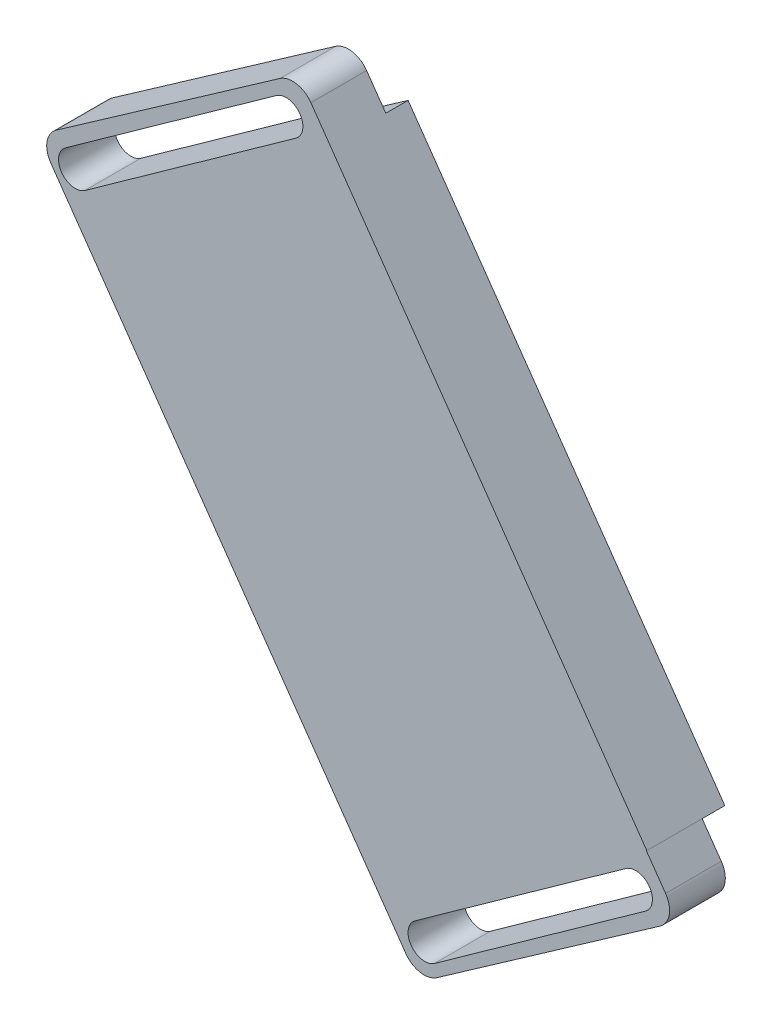
ISO-10303-21;
HEADER;
FILE_DESCRIPTION(('STEP AP214'),'2;1');
FILE_NAME('part.step','',(''),(''),'','','');
FILE_SCHEMA(('AUTOMOTIVE_DESIGN { 1 0 10303 214 1 1 1 1 }'));
ENDSEC;
DATA;
#1=APPLICATION_CONTEXT('core data for automotive mechanical design processes');
#2=APPLICATION_PROTOCOL_DEFINITION('international standard','automotive_design',2000,#1);
#3=PRODUCT_CONTEXT('',#1,'mechanical');
#4=PRODUCT('Part','Part','',(#3));
#5=PRODUCT_RELATED_PRODUCT_CATEGORY('part','',(#4));
#6=PRODUCT_DEFINITION_FORMATION('','',#4);
#7=PRODUCT_DEFINITION_CONTEXT('part definition',#1,'design');
#8=PRODUCT_DEFINITION('design','',#6,#7);
#9=PRODUCT_DEFINITION_SHAPE('','',#8);
#10=(LENGTH_UNIT() NAMED_UNIT(*) SI_UNIT(.MILLI.,.METRE.));
#11=(NAMED_UNIT(*) PLANE_ANGLE_UNIT() SI_UNIT($,.RADIAN.));
#12=(NAMED_UNIT(*) SI_UNIT($,.STERADIAN.) SOLID_ANGLE_UNIT());
#13=UNCERTAINTY_MEASURE_WITH_UNIT(LENGTH_MEASURE(1.E-05),#10,'distance_accuracy_value','');
#14=(GEOMETRIC_REPRESENTATION_CONTEXT(3) GLOBAL_UNCERTAINTY_ASSIGNED_CONTEXT((#13)) GLOBAL_UNIT_ASSIGNED_CONTEXT((#10,
#11,#12)) REPRESENTATION_CONTEXT('',''));
#15=CARTESIAN_POINT('',(0.,0.,0.));
#16=DIRECTION('',(0.,0.,1.));
#17=DIRECTION('',(1.,0.,0.));
#18=AXIS2_PLACEMENT_3D('',#15,#16,#17);
#19=CARTESIAN_POINT('',(-15.9091061048181,13.6425802063685,7.));
#20=DIRECTION('',(-0.573576436351048,0.81915204428899,0.));
#21=DIRECTION('',(-0.81915204428899,-0.573576436351048,0.));
#22=AXIS2_PLACEMENT_3D('',#19,#20,#21);
#23=PLANE('',#22);
#24=DIRECTION('',(0.,0.,-1.));
#25=VECTOR('',#24,1.);
#26=CARTESIAN_POINT('',(-15.9091061048181,13.6425802063685,7.));
#27=LINE('',#26,#25);
#28=CARTESIAN_POINT('',(-15.9091061048181,13.6425802063685,2.));
#29=VERTEX_POINT('',#28);
#30=CARTESIAN_POINT('',(-15.9091061048181,13.6425802063685,0.));
#31=VERTEX_POINT('',#30);
#32=EDGE_CURVE('E420',#29,#31,#27,.T.);
#33=ORIENTED_EDGE('',*,*,#32,.F.);
#34=DIRECTION('',(-0.81915204428899,-0.573576436351048,0.));
#35=VECTOR('',#34,1.);
#36=CARTESIAN_POINT('',(-15.9091061048181,13.6425802063685,2.));
#37=LINE('',#36,#35);
#38=CARTESIAN_POINT('',(7.43672715741817,29.9895086423735,2.));
#39=VERTEX_POINT('',#38);
#40=EDGE_CURVE('E285',#39,#29,#37,.T.);
#41=ORIENTED_EDGE('',*,*,#40,.F.);
#42=DIRECTION('',(0.,0.,1.));
#43=VECTOR('',#42,1.);
#44=CARTESIAN_POINT('',(7.4367271574182,29.9895086423734,7.));
#45=LINE('',#44,#43);
#46=CARTESIAN_POINT('',(7.4367271574182,29.9895086423734,0.));
#47=VERTEX_POINT('',#46);
#48=EDGE_CURVE('E339',#47,#39,#45,.T.);
#49=ORIENTED_EDGE('',*,*,#48,.F.);
#50=DIRECTION('',(0.81915204428899,0.573576436351048,0.));
#51=VECTOR('',#50,1.);
#52=CARTESIAN_POINT('',(-15.9091061048181,13.6425802063685,0.));
#53=LINE('',#52,#51);
#54=EDGE_CURVE('E417',#31,#47,#53,.T.);
#55=ORIENTED_EDGE('',*,*,#54,.F.);
#56=EDGE_LOOP('',(#33,#41,#49,#55));
#57=FACE_BOUND('',#56,.T.);
#58=ADVANCED_FACE('F58',(#57),#23,.T.);
#59=CARTESIAN_POINT('',(12.5116063163763,-26.9464035881509,7.));
#60=DIRECTION('',(-0.573576436351045,0.819152044288992,0.));
#61=DIRECTION('',(-0.819152044288992,-0.573576436351045,0.));
#62=AXIS2_PLACEMENT_3D('',#59,#60,#61);
#63=PLANE('',#62);
#64=DIRECTION('',(0.819152044288992,0.573576436351045,0.));
#65=VECTOR('',#64,1.);
#66=CARTESIAN_POINT('',(12.5116063163763,-26.9464035881509,2.));
#67=LINE('',#66,#65);
#68=CARTESIAN_POINT('',(12.5116063163763,-26.9464035881509,2.));
#69=VERTEX_POINT('',#68);
#70=CARTESIAN_POINT('',(35.8186756591524,-10.6266179407626,2.));
#71=VERTEX_POINT('',#70);
#72=EDGE_CURVE('E321',#69,#71,#67,.T.);
#73=ORIENTED_EDGE('',*,*,#72,.F.);
#74=DIRECTION('',(0.,0.,-1.));
#75=VECTOR('',#74,1.);
#76=CARTESIAN_POINT('',(12.5116063163763,-26.9464035881509,7.));
#77=LINE('',#76,#75);
#78=CARTESIAN_POINT('',(12.5116063163763,-26.9464035881509,0.));
#79=VERTEX_POINT('',#78);
#80=EDGE_CURVE('E427',#69,#79,#77,.T.);
#81=ORIENTED_EDGE('',*,*,#80,.T.);
#82=DIRECTION('',(0.819152044288992,0.573576436351045,0.));
#83=VECTOR('',#82,1.);
#84=CARTESIAN_POINT('',(12.5116063163763,-26.9464035881509,0.));
#85=LINE('',#84,#83);
#86=CARTESIAN_POINT('',(35.8574395786125,-10.5994751521461,0.));
#87=VERTEX_POINT('',#86);
#88=EDGE_CURVE('E423',#79,#87,#85,.T.);
#89=ORIENTED_EDGE('',*,*,#88,.T.);
#90=DIRECTION('',(0.,0.,1.));
#91=VECTOR('',#90,1.);
#92=CARTESIAN_POINT('',(35.8574395786125,-10.5994751521461,7.));
#93=LINE('',#92,#91);
#94=CARTESIAN_POINT('',(35.8574395786125,-10.5994751521461,7.));
#95=VERTEX_POINT('',#94);
#96=EDGE_CURVE('E338',#87,#95,#93,.T.);
#97=ORIENTED_EDGE('',*,*,#96,.T.);
#98=DIRECTION('',(0.819152044288992,0.573576436351045,0.));
#99=VECTOR('',#98,1.);
#100=CARTESIAN_POINT('',(12.5116063163763,-26.9464035881509,7.));
#101=LINE('',#100,#99);
#102=CARTESIAN_POINT('',(35.8186756591524,-10.6266179407626,7.));
#103=VERTEX_POINT('',#102);
#104=EDGE_CURVE('E416',#103,#95,#101,.T.);
#105=ORIENTED_EDGE('',*,*,#104,.F.);
#106=DIRECTION('',(0.,0.,1.));
#107=VECTOR('',#106,1.);
#108=CARTESIAN_POINT('',(35.8186756591524,-10.6266179407626,2.));
#109=LINE('',#108,#107);
#110=EDGE_CURVE('E325',#71,#103,#109,.T.);
#111=ORIENTED_EDGE('',*,*,#110,.F.);
#112=EDGE_LOOP('',(#73,#81,#89,#97,#105,#111));
#113=FACE_BOUND('',#112,.T.);
#114=ADVANCED_FACE('F503',(#113),#63,.F.);
#115=CARTESIAN_POINT('',(0.,0.,0.));
#116=DIRECTION('',(0.,0.,1.));
#117=DIRECTION('',(1.,0.,0.));
#118=AXIS2_PLACEMENT_3D('',#115,#116,#117);
#119=PLANE('',#118);
#120=DIRECTION('',(0.573576436351048,-0.819152044288991,0.));
#121=VECTOR('',#120,1.);
#122=CARTESIAN_POINT('',(-15.9091061048181,13.6425802063685,0.));
#123=LINE('',#122,#121);
#124=EDGE_CURVE('E412',#31,#79,#123,.T.);
#125=ORIENTED_EDGE('',*,*,#124,.F.);
#126=ORIENTED_EDGE('',*,*,#54,.T.);
#127=DIRECTION('',(0.573576436351045,-0.819152044288992,0.));
#128=VECTOR('',#127,1.);
#129=CARTESIAN_POINT('',(7.4367271574182,29.9895086423734,0.));
#130=LINE('',#129,#128);
#131=EDGE_CURVE('E342',#47,#87,#130,.T.);
#132=ORIENTED_EDGE('',*,*,#131,.T.);
#133=ORIENTED_EDGE('',*,*,#88,.F.);
#134=EDGE_LOOP('',(#125,#126,#132,#133));
#135=FACE_BOUND('',#134,.T.);
#136=DIRECTION('',(0.819152044289,0.573576436351034,0.));
#137=VECTOR('',#136,1.);
#138=CARTESIAN_POINT('',(16.6392073779755,-23.7632508506252,0.));
#139=LINE('',#138,#137);
#140=CARTESIAN_POINT('',(13.2041115311021,-26.1685308570787,0.));
#141=VERTEX_POINT('',#140);
#142=CARTESIAN_POINT('',(13.6956027576755,-25.8243849952681,0.));
#143=VERTEX_POINT('',#142);
#144=EDGE_CURVE('E387',#141,#143,#139,.T.);
#145=ORIENTED_EDGE('',*,*,#144,.T.);
#146=DIRECTION('',(0.573576436351045,-0.819152044288992,0.));
#147=VECTOR('',#146,1.);
#148=CARTESIAN_POINT('',(-2.94360462030027,-2.06113414464318,0.));
#149=LINE('',#148,#147);
#150=CARTESIAN_POINT('',(-14.5004018426838,14.4436827728267,0.));
#151=VERTEX_POINT('',#150);
#152=EDGE_CURVE('E382',#151,#143,#149,.T.);
#153=ORIENTED_EDGE('',*,*,#152,.F.);
#154=DIRECTION('',(0.819152044288993,0.573576436351045,0.));
#155=VECTOR('',#154,1.);
#156=CARTESIAN_POINT('',(-11.5567972223835,16.5048169174699,0.));
#157=LINE('',#156,#155);
#158=CARTESIAN_POINT('',(-14.9918930692572,14.0995369110161,0.));
#159=VERTEX_POINT('',#158);
#160=EDGE_CURVE('E396',#159,#151,#157,.T.);
#161=ORIENTED_EDGE('',*,*,#160,.F.);
#162=DIRECTION('',(0.573576436351045,-0.819152044288992,0.));
#163=VECTOR('',#162,1.);
#164=CARTESIAN_POINT('',(-3.43509584687367,-2.4052800064538,0.));
#165=LINE('',#164,#163);
#166=EDGE_CURVE('E399',#159,#141,#165,.T.);
#167=ORIENTED_EDGE('',*,*,#166,.T.);
#168=EDGE_LOOP('',(#145,#153,#161,#167));
#169=FACE_BOUND('',#168,.T.);
#170=DIRECTION('',(-0.819152044288987,-0.573576436351053,0.));
#171=VECTOR('',#170,1.);
#172=CARTESIAN_POINT('',(-11.5326628883823,16.4703495164716,0.));
#173=LINE('',#172,#171);
#174=CARTESIAN_POINT('',(-6.36666227022138,20.087622091704,0.));
#175=VERTEX_POINT('',#174);
#176=CARTESIAN_POINT('',(-6.85815349679478,19.7434762298934,0.));
#177=VERTEX_POINT('',#176);
#178=EDGE_CURVE('E347',#175,#177,#173,.T.);
#179=ORIENTED_EDGE('',*,*,#178,.T.);
#180=DIRECTION('',(0.573576436351053,-0.819152044288987,0.));
#181=VECTOR('',#180,1.);
#182=CARTESIAN_POINT('',(4.67450939158751,3.27312671342172,0.));
#183=LINE('',#182,#181);
#184=CARTESIAN_POINT('',(21.3049039693914,-20.4775381542033,0.));
#185=VERTEX_POINT('',#184);
#186=EDGE_CURVE('E365',#177,#185,#183,.T.);
#187=ORIENTED_EDGE('',*,*,#186,.T.);
#188=DIRECTION('',(-0.819152044288988,-0.573576436351051,0.));
#189=VECTOR('',#188,1.);
#190=CARTESIAN_POINT('',(16.6303945778038,-23.7506648676251,0.));
#191=LINE('',#190,#189);
#192=CARTESIAN_POINT('',(21.7963951959648,-20.1333922923927,0.));
#193=VERTEX_POINT('',#192);
#194=EDGE_CURVE('E368',#193,#185,#191,.T.);
#195=ORIENTED_EDGE('',*,*,#194,.F.);
#196=DIRECTION('',(0.573576436351053,-0.819152044288987,0.));
#197=VECTOR('',#196,1.);
#198=CARTESIAN_POINT('',(5.16600061816091,3.61727257523235,0.));
#199=LINE('',#198,#197);
#200=EDGE_CURVE('E354',#175,#193,#199,.T.);
#201=ORIENTED_EDGE('',*,*,#200,.F.);
#202=EDGE_LOOP('',(#179,#187,#195,#201));
#203=FACE_BOUND('',#202,.T.);
#204=ADVANCED_FACE('F532',(#135,#169,#203),#119,.F.);
#205=CARTESIAN_POINT('',(-15.9091061048181,13.6425802063685,7.));
#206=DIRECTION('',(0.819152044288991,0.573576436351048,0.));
#207=DIRECTION('',(-0.573576436351048,0.819152044288991,0.));
#208=AXIS2_PLACEMENT_3D('',#205,#206,#207);
#209=PLANE('',#208);
#210=DIRECTION('',(0.573576436351048,-0.819152044288991,0.));
#211=VECTOR('',#210,1.);
#212=CARTESIAN_POINT('',(-15.9091061048181,13.6425802063685,7.));
#213=LINE('',#212,#211);
#214=CARTESIAN_POINT('',(-17.6298354138713,16.1000363392355,7.));
#215=VERTEX_POINT('',#214);
#216=CARTESIAN_POINT('',(14.2323356254294,-29.4038597210179,7.));
#217=VERTEX_POINT('',#216);
#218=EDGE_CURVE('E413',#215,#217,#213,.T.);
#219=ORIENTED_EDGE('',*,*,#218,.F.);
#220=DIRECTION('',(0.,0.,1.));
#221=VECTOR('',#220,1.);
#222=CARTESIAN_POINT('',(-17.6298354138713,16.1000363392355,7.));
#223=LINE('',#222,#221);
#224=CARTESIAN_POINT('',(-17.6298354138713,16.1000363392355,2.));
#225=VERTEX_POINT('',#224);
#226=EDGE_CURVE('E466',#215,#225,#223,.F.);
#227=ORIENTED_EDGE('',*,*,#226,.T.);
#228=DIRECTION('',(0.573576436351048,-0.81915204428899,0.));
#229=VECTOR('',#228,1.);
#230=CARTESIAN_POINT('',(-18.7769882865734,17.7383404278135,2.));
#231=LINE('',#230,#229);
#232=EDGE_CURVE('E315',#225,#29,#231,.T.);
#233=ORIENTED_EDGE('',*,*,#232,.T.);
#234=ORIENTED_EDGE('',*,*,#32,.T.);
#235=ORIENTED_EDGE('',*,*,#124,.T.);
#236=ORIENTED_EDGE('',*,*,#80,.F.);
#237=DIRECTION('',(-0.573576436351045,0.819152044288992,0.));
#238=VECTOR('',#237,1.);
#239=CARTESIAN_POINT('',(15.3794884981315,-31.0421638095959,2.));
#240=LINE('',#239,#238);
#241=CARTESIAN_POINT('',(14.2323356254294,-29.4038597210179,2.));
#242=VERTEX_POINT('',#241);
#243=EDGE_CURVE('E336',#242,#69,#240,.T.);
#244=ORIENTED_EDGE('',*,*,#243,.F.);
#245=DIRECTION('',(0.,0.,-1.));
#246=VECTOR('',#245,1.);
#247=CARTESIAN_POINT('',(14.2323356254294,-29.4038597210179,7.));
#248=LINE('',#247,#246);
#249=EDGE_CURVE('E464',#242,#217,#248,.F.);
#250=ORIENTED_EDGE('',*,*,#249,.T.);
#251=EDGE_LOOP('',(#219,#227,#233,#234,#235,#236,#244,#250));
#252=FACE_BOUND('',#251,.T.);
#253=ADVANCED_FACE('F489',(#252),#209,.F.);
#254=CARTESIAN_POINT('',(0.,0.,7.));
#255=DIRECTION('',(0.,0.,1.));
#256=DIRECTION('',(1.,0.,0.));
#257=AXIS2_PLACEMENT_3D('',#254,#255,#256);
#258=PLANE('',#257);
#259=CARTESIAN_POINT('',(34.8610503496757,-14.1440881042099,7.00000000000001));
#260=DIRECTION('',(0.,0.,-1.));
#261=DIRECTION('',(-1.,0.,0.));
#262=AXIS2_PLACEMENT_3D('',#259,#260,#261);
#263=CIRCLE('',#262,1.5);
#264=CARTESIAN_POINT('',(33.9887755083496,-12.9237862558177,7.00000000000001));
#265=VERTEX_POINT('',#264);
#266=CARTESIAN_POINT('',(35.7333251910018,-15.3643899526022,7.00000000000001));
#267=VERTEX_POINT('',#266);
#268=EDGE_CURVE('E254',#265,#267,#263,.T.);
#269=ORIENTED_EDGE('',*,*,#268,.T.);
#270=DIRECTION('',(-0.813534565594845,-0.581516560884044,0.));
#271=VECTOR('',#270,1.);
#272=CARTESIAN_POINT('',(35.7333251910018,-15.3643899526022,7.00000000000001));
#273=LINE('',#272,#271);
#274=CARTESIAN_POINT('',(16.8071757288284,-28.8928493585933,7.));
#275=VERTEX_POINT('',#274);
#276=EDGE_CURVE('E265',#267,#275,#273,.T.);
#277=ORIENTED_EDGE('',*,*,#276,.T.);
#278=CARTESIAN_POINT('',(15.9349008875023,-27.6725475102011,7.00000000000001));
#279=DIRECTION('',(0.,0.,-1.));
#280=DIRECTION('',(-1.,0.,0.));
#281=AXIS2_PLACEMENT_3D('',#278,#279,#280);
#282=CIRCLE('',#281,1.5);
#283=CARTESIAN_POINT('',(15.0626260461762,-26.4522456618088,7.00000000000001));
#284=VERTEX_POINT('',#283);
#285=EDGE_CURVE('E270',#275,#284,#282,.T.);
#286=ORIENTED_EDGE('',*,*,#285,.T.);
#287=DIRECTION('',(0.813534565594845,0.581516560884044,0.));
#288=VECTOR('',#287,1.);
#289=CARTESIAN_POINT('',(33.9887755083496,-12.9237862558177,7.00000000000001));
#290=LINE('',#289,#288);
#291=EDGE_CURVE('E261',#284,#265,#290,.T.);
#292=ORIENTED_EDGE('',*,*,#291,.T.);
#293=EDGE_LOOP('',(#269,#277,#286,#292));
#294=FACE_BOUND('',#293,.T.);
#295=CARTESIAN_POINT('',(3.4964367911128,30.2392771419821,7.00000000000001));
#296=DIRECTION('',(0.,0.,-1.));
#297=DIRECTION('',(-1.,0.,0.));
#298=AXIS2_PLACEMENT_3D('',#295,#296,#297);
#299=CIRCLE('',#298,1.50000000000001);
#300=CARTESIAN_POINT('',(2.62416194978673,31.4595789903744,7.00000000000001));
#301=VERTEX_POINT('',#300);
#302=CARTESIAN_POINT('',(4.36871163243887,29.0189752935899,7.00000000000001));
#303=VERTEX_POINT('',#302);
#304=EDGE_CURVE('E290',#301,#303,#299,.T.);
#305=ORIENTED_EDGE('',*,*,#304,.T.);
#306=DIRECTION('',(-0.813534565594845,-0.581516560884044,0.));
#307=VECTOR('',#306,1.);
#308=CARTESIAN_POINT('',(4.36871163243887,29.0189752935899,7.00000000000001));
#309=LINE('',#308,#307);
#310=CARTESIAN_POINT('',(-14.5574378297346,15.4905158875988,7.));
#311=VERTEX_POINT('',#310);
#312=EDGE_CURVE('E293',#303,#311,#309,.T.);
#313=ORIENTED_EDGE('',*,*,#312,.T.);
#314=CARTESIAN_POINT('',(-15.4297126710606,16.710817735991,7.00000000000001));
#315=DIRECTION('',(0.,0.,-1.));
#316=DIRECTION('',(-1.,0.,0.));
#317=AXIS2_PLACEMENT_3D('',#314,#315,#316);
#318=CIRCLE('',#317,1.5);
#319=CARTESIAN_POINT('',(-16.3019875123867,17.9311195843833,7.00000000000001));
#320=VERTEX_POINT('',#319);
#321=EDGE_CURVE('E296',#311,#320,#318,.T.);
#322=ORIENTED_EDGE('',*,*,#321,.T.);
#323=DIRECTION('',(0.813534565594845,0.581516560884044,0.));
#324=VECTOR('',#323,1.);
#325=CARTESIAN_POINT('',(2.62416194978673,31.4595789903744,7.00000000000001));
#326=LINE('',#325,#324);
#327=EDGE_CURVE('E299',#320,#301,#326,.T.);
#328=ORIENTED_EDGE('',*,*,#327,.T.);
#329=EDGE_LOOP('',(#305,#313,#322,#328));
#330=FACE_BOUND('',#329,.T.);
#331=DIRECTION('',(0.81915204428899,0.573576436351048,0.));
#332=VECTOR('',#331,1.);
#333=CARTESIAN_POINT('',(-18.7769882865734,17.7383404278135,7.));
#334=LINE('',#333,#332);
#335=CARTESIAN_POINT('',(-17.1386841979954,18.8854933005156,7.));
#336=VERTEX_POINT('',#335);
#337=CARTESIAN_POINT('',(2.93054088708496,32.9381159911164,7.));
#338=VERTEX_POINT('',#337);
#339=EDGE_CURVE('E309',#336,#338,#334,.T.);
#340=ORIENTED_EDGE('',*,*,#339,.F.);
#341=CARTESIAN_POINT('',(-15.9915313252933,17.2471892119376,7.));
#342=DIRECTION('',(0.,0.,1.));
#343=DIRECTION('',(1.,0.,0.));
#344=AXIS2_PLACEMENT_3D('',#341,#342,#343);
#345=CIRCLE('',#344,2.);
#346=EDGE_CURVE('E462',#336,#215,#345,.T.);
#347=ORIENTED_EDGE('',*,*,#346,.T.);
#348=ORIENTED_EDGE('',*,*,#218,.T.);
#349=CARTESIAN_POINT('',(15.8706397140074,-28.2567068483158,7.));
#350=DIRECTION('',(0.,0.,1.));
#351=DIRECTION('',(1.,0.,0.));
#352=AXIS2_PLACEMENT_3D('',#349,#350,#351);
#353=CIRCLE('',#352,2.);
#354=CARTESIAN_POINT('',(17.0177925867095,-29.8950109368938,7.));
#355=VERTEX_POINT('',#354);
#356=EDGE_CURVE('E458',#217,#355,#353,.T.);
#357=ORIENTED_EDGE('',*,*,#356,.T.);
#358=DIRECTION('',(-0.819152044288992,-0.573576436351045,0.));
#359=VECTOR('',#358,1.);
#360=CARTESIAN_POINT('',(15.3794884981315,-31.0421638095959,7.));
#361=LINE('',#360,#359);
#362=CARTESIAN_POINT('',(37.0482537523297,-15.8695310349097,7.));
#363=VERTEX_POINT('',#362);
#364=EDGE_CURVE('E324',#363,#355,#361,.T.);
#365=ORIENTED_EDGE('',*,*,#364,.F.);
#366=CARTESIAN_POINT('',(35.9011008796276,-14.2312269463317,7.));
#367=DIRECTION('',(0.,0.,1.));
#368=DIRECTION('',(1.,0.,0.));
#369=AXIS2_PLACEMENT_3D('',#366,#367,#368);
#370=CIRCLE('',#369,2.);
#371=CARTESIAN_POINT('',(37.5394049682056,-13.0840740736296,7.));
#372=VERTEX_POINT('',#371);
#373=EDGE_CURVE('E456',#363,#372,#370,.T.);
#374=ORIENTED_EDGE('',*,*,#373,.T.);
#375=DIRECTION('',(-0.573576436351045,0.819152044288992,0.));
#376=VECTOR('',#375,1.);
#377=CARTESIAN_POINT('',(38.6865578409077,-14.7223781622076,7.));
#378=LINE('',#377,#376);
#379=EDGE_CURVE('E328',#372,#103,#378,.T.);
#380=ORIENTED_EDGE('',*,*,#379,.T.);
#381=ORIENTED_EDGE('',*,*,#104,.T.);
#382=DIRECTION('',(0.573576436351045,-0.819152044288992,0.));
#383=VECTOR('',#382,1.);
#384=CARTESIAN_POINT('',(7.4367271574182,29.9895086423734,7.));
#385=LINE('',#384,#383);
#386=CARTESIAN_POINT('',(5.71599784836502,32.4469647752405,7.));
#387=VERTEX_POINT('',#386);
#388=EDGE_CURVE('E345',#387,#95,#385,.T.);
#389=ORIENTED_EDGE('',*,*,#388,.F.);
#390=CARTESIAN_POINT('',(4.07769375978704,31.2998119025384,7.));
#391=DIRECTION('',(0.,0.,1.));
#392=DIRECTION('',(1.,0.,0.));
#393=AXIS2_PLACEMENT_3D('',#390,#391,#392);
#394=CIRCLE('',#393,2.);
#395=EDGE_CURVE('E460',#387,#338,#394,.T.);
#396=ORIENTED_EDGE('',*,*,#395,.T.);
#397=EDGE_LOOP('',(#340,#347,#348,#357,#365,#374,#380,#381,#389,#396));
#398=FACE_BOUND('',#397,.T.);
#399=ADVANCED_FACE('F272',(#294,#330,#398),#258,.T.);
#400=CARTESIAN_POINT('',(-2.94360462030027,-2.06113414464318,6.));
#401=DIRECTION('',(0.819152044288992,0.573576436351045,0.));
#402=DIRECTION('',(-0.573576436351045,0.819152044288992,0.));
#403=AXIS2_PLACEMENT_3D('',#400,#401,#402);
#404=PLANE('',#403);
#405=ORIENTED_EDGE('',*,*,#152,.T.);
#406=DIRECTION('',(0.,0.,-1.));
#407=VECTOR('',#406,1.);
#408=CARTESIAN_POINT('',(13.6956027576755,-25.8243849952681,6.));
#409=LINE('',#408,#407);
#410=CARTESIAN_POINT('',(13.6956027576755,-25.8243849952681,6.));
#411=VERTEX_POINT('',#410);
#412=EDGE_CURVE('E394',#411,#143,#409,.T.);
#413=ORIENTED_EDGE('',*,*,#412,.F.);
#414=DIRECTION('',(0.573576436351045,-0.819152044288992,0.));
#415=VECTOR('',#414,1.);
#416=CARTESIAN_POINT('',(-2.94360462030027,-2.06113414464318,6.));
#417=LINE('',#416,#415);
#418=CARTESIAN_POINT('',(-14.5004018426838,14.4436827728267,6.));
#419=VERTEX_POINT('',#418);
#420=EDGE_CURVE('E383',#419,#411,#417,.T.);
#421=ORIENTED_EDGE('',*,*,#420,.F.);
#422=DIRECTION('',(0.,0.,-1.));
#423=VECTOR('',#422,1.);
#424=CARTESIAN_POINT('',(-14.5004018426838,14.4436827728267,6.));
#425=LINE('',#424,#423);
#426=EDGE_CURVE('E410',#419,#151,#425,.T.);
#427=ORIENTED_EDGE('',*,*,#426,.T.);
#428=EDGE_LOOP('',(#405,#413,#421,#427));
#429=FACE_BOUND('',#428,.T.);
#430=ADVANCED_FACE('F644',(#429),#404,.F.);
#431=CARTESIAN_POINT('',(-11.5567972223835,16.5048169174699,6.));
#432=DIRECTION('',(-0.573576436351045,0.819152044288993,0.));
#433=DIRECTION('',(-0.819152044288993,-0.573576436351045,0.));
#434=AXIS2_PLACEMENT_3D('',#431,#432,#433);
#435=PLANE('',#434);
#436=ORIENTED_EDGE('',*,*,#160,.T.);
#437=ORIENTED_EDGE('',*,*,#426,.F.);
#438=DIRECTION('',(0.819152044288993,0.573576436351045,0.));
#439=VECTOR('',#438,1.);
#440=CARTESIAN_POINT('',(-11.5567972223835,16.5048169174699,6.));
#441=LINE('',#440,#439);
#442=CARTESIAN_POINT('',(-14.9918930692572,14.0995369110161,6.));
#443=VERTEX_POINT('',#442);
#444=EDGE_CURVE('E386',#443,#419,#441,.T.);
#445=ORIENTED_EDGE('',*,*,#444,.F.);
#446=DIRECTION('',(0.,0.,-1.));
#447=VECTOR('',#446,1.);
#448=CARTESIAN_POINT('',(-14.9918930692572,14.0995369110161,6.));
#449=LINE('',#448,#447);
#450=EDGE_CURVE('E408',#443,#159,#449,.T.);
#451=ORIENTED_EDGE('',*,*,#450,.T.);
#452=EDGE_LOOP('',(#436,#437,#445,#451));
#453=FACE_BOUND('',#452,.T.);
#454=ADVANCED_FACE('F817',(#453),#435,.F.);
#455=CARTESIAN_POINT('',(-3.43509584687367,-2.4052800064538,6.));
#456=DIRECTION('',(0.819152044288992,0.573576436351045,0.));
#457=DIRECTION('',(-0.573576436351045,0.819152044288992,0.));
#458=AXIS2_PLACEMENT_3D('',#455,#456,#457);
#459=PLANE('',#458);
#460=ORIENTED_EDGE('',*,*,#166,.F.);
#461=ORIENTED_EDGE('',*,*,#450,.F.);
#462=DIRECTION('',(0.573576436351045,-0.819152044288992,0.));
#463=VECTOR('',#462,1.);
#464=CARTESIAN_POINT('',(-3.43509584687367,-2.4052800064538,6.));
#465=LINE('',#464,#463);
#466=CARTESIAN_POINT('',(13.2041115311021,-26.1685308570787,6.));
#467=VERTEX_POINT('',#466);
#468=EDGE_CURVE('E390',#443,#467,#465,.T.);
#469=ORIENTED_EDGE('',*,*,#468,.T.);
#470=DIRECTION('',(0.,0.,-1.));
#471=VECTOR('',#470,1.);
#472=CARTESIAN_POINT('',(13.2041115311021,-26.1685308570787,6.));
#473=LINE('',#472,#471);
#474=EDGE_CURVE('E406',#467,#141,#473,.T.);
#475=ORIENTED_EDGE('',*,*,#474,.T.);
#476=EDGE_LOOP('',(#460,#461,#469,#475));
#477=FACE_BOUND('',#476,.T.);
#478=ADVANCED_FACE('F807',(#477),#459,.T.);
#479=CARTESIAN_POINT('',(16.6392073779755,-23.7632508506252,6.));
#480=DIRECTION('',(-0.573576436351034,0.819152044289,0.));
#481=DIRECTION('',(-0.819152044289,-0.573576436351034,0.));
#482=AXIS2_PLACEMENT_3D('',#479,#480,#481);
#483=PLANE('',#482);
#484=ORIENTED_EDGE('',*,*,#144,.F.);
#485=ORIENTED_EDGE('',*,*,#474,.F.);
#486=DIRECTION('',(0.819152044289,0.573576436351034,0.));
#487=VECTOR('',#486,1.);
#488=CARTESIAN_POINT('',(16.6392073779755,-23.7632508506252,6.));
#489=LINE('',#488,#487);
#490=EDGE_CURVE('E392',#467,#411,#489,.T.);
#491=ORIENTED_EDGE('',*,*,#490,.T.);
#492=ORIENTED_EDGE('',*,*,#412,.T.);
#493=EDGE_LOOP('',(#484,#485,#491,#492));
#494=FACE_BOUND('',#493,.T.);
#495=ADVANCED_FACE('F797',(#494),#483,.T.);
#496=CARTESIAN_POINT('',(0.,0.,6.));
#497=DIRECTION('',(0.,0.,1.));
#498=DIRECTION('',(1.,0.,0.));
#499=AXIS2_PLACEMENT_3D('',#496,#497,#498);
#500=PLANE('',#499);
#501=ORIENTED_EDGE('',*,*,#420,.T.);
#502=ORIENTED_EDGE('',*,*,#490,.F.);
#503=ORIENTED_EDGE('',*,*,#468,.F.);
#504=ORIENTED_EDGE('',*,*,#444,.T.);
#505=EDGE_LOOP('',(#501,#502,#503,#504));
#506=FACE_BOUND('',#505,.T.);
#507=ADVANCED_FACE('F787',(#506),#500,.F.);
#508=CARTESIAN_POINT('',(-11.5326628883823,16.4703495164716,6.));
#509=DIRECTION('',(0.573576436351053,-0.819152044288987,0.));
#510=DIRECTION('',(0.819152044288987,0.573576436351053,0.));
#511=AXIS2_PLACEMENT_3D('',#508,#509,#510);
#512=PLANE('',#511);
#513=ORIENTED_EDGE('',*,*,#178,.F.);
#514=DIRECTION('',(0.,0.,-1.));
#515=VECTOR('',#514,1.);
#516=CARTESIAN_POINT('',(-6.36666227022138,20.087622091704,6.));
#517=LINE('',#516,#515);
#518=CARTESIAN_POINT('',(-6.36666227022138,20.087622091704,6.));
#519=VERTEX_POINT('',#518);
#520=EDGE_CURVE('E362',#519,#175,#517,.T.);
#521=ORIENTED_EDGE('',*,*,#520,.F.);
#522=DIRECTION('',(-0.819152044288987,-0.573576436351053,0.));
#523=VECTOR('',#522,1.);
#524=CARTESIAN_POINT('',(-11.5326628883823,16.4703495164716,6.));
#525=LINE('',#524,#523);
#526=CARTESIAN_POINT('',(-6.85815349679478,19.7434762298934,6.));
#527=VERTEX_POINT('',#526);
#528=EDGE_CURVE('E350',#519,#527,#525,.T.);
#529=ORIENTED_EDGE('',*,*,#528,.T.);
#530=DIRECTION('',(0.,0.,-1.));
#531=VECTOR('',#530,1.);
#532=CARTESIAN_POINT('',(-6.85815349679478,19.7434762298934,6.));
#533=LINE('',#532,#531);
#534=EDGE_CURVE('E379',#527,#177,#533,.T.);
#535=ORIENTED_EDGE('',*,*,#534,.T.);
#536=EDGE_LOOP('',(#513,#521,#529,#535));
#537=FACE_BOUND('',#536,.T.);
#538=ADVANCED_FACE('F777',(#537),#512,.T.);
#539=CARTESIAN_POINT('',(4.67450939158751,3.27312671342172,6.));
#540=DIRECTION('',(0.819152044288987,0.573576436351053,0.));
#541=DIRECTION('',(-0.573576436351053,0.819152044288987,0.));
#542=AXIS2_PLACEMENT_3D('',#539,#540,#541);
#543=PLANE('',#542);
#544=ORIENTED_EDGE('',*,*,#186,.F.);
#545=ORIENTED_EDGE('',*,*,#534,.F.);
#546=DIRECTION('',(0.573576436351053,-0.819152044288987,0.));
#547=VECTOR('',#546,1.);
#548=CARTESIAN_POINT('',(4.67450939158751,3.27312671342172,6.));
#549=LINE('',#548,#547);
#550=CARTESIAN_POINT('',(21.3049039693914,-20.4775381542033,6.));
#551=VERTEX_POINT('',#550);
#552=EDGE_CURVE('E353',#527,#551,#549,.T.);
#553=ORIENTED_EDGE('',*,*,#552,.T.);
#554=DIRECTION('',(0.,0.,-1.));
#555=VECTOR('',#554,1.);
#556=CARTESIAN_POINT('',(21.3049039693914,-20.4775381542033,6.));
#557=LINE('',#556,#555);
#558=EDGE_CURVE('E377',#551,#185,#557,.T.);
#559=ORIENTED_EDGE('',*,*,#558,.T.);
#560=EDGE_LOOP('',(#544,#545,#553,#559));
#561=FACE_BOUND('',#560,.T.);
#562=ADVANCED_FACE('F767',(#561),#543,.T.);
#563=CARTESIAN_POINT('',(16.6303945778038,-23.7506648676251,6.));
#564=DIRECTION('',(0.573576436351051,-0.819152044288988,0.));
#565=DIRECTION('',(0.819152044288988,0.573576436351051,0.));
#566=AXIS2_PLACEMENT_3D('',#563,#564,#565);
#567=PLANE('',#566);
#568=ORIENTED_EDGE('',*,*,#194,.T.);
#569=ORIENTED_EDGE('',*,*,#558,.F.);
#570=DIRECTION('',(-0.819152044288988,-0.573576436351051,0.));
#571=VECTOR('',#570,1.);
#572=CARTESIAN_POINT('',(16.6303945778038,-23.7506648676251,6.));
#573=LINE('',#572,#571);
#574=CARTESIAN_POINT('',(21.7963951959648,-20.1333922923927,6.));
#575=VERTEX_POINT('',#574);
#576=EDGE_CURVE('E356',#575,#551,#573,.T.);
#577=ORIENTED_EDGE('',*,*,#576,.F.);
#578=DIRECTION('',(0.,0.,-1.));
#579=VECTOR('',#578,1.);
#580=CARTESIAN_POINT('',(21.7963951959648,-20.1333922923927,6.));
#581=LINE('',#580,#579);
#582=EDGE_CURVE('E375',#575,#193,#581,.T.);
#583=ORIENTED_EDGE('',*,*,#582,.T.);
#584=EDGE_LOOP('',(#568,#569,#577,#583));
#585=FACE_BOUND('',#584,.T.);
#586=ADVANCED_FACE('F757',(#585),#567,.F.);
#587=CARTESIAN_POINT('',(5.16600061816091,3.61727257523235,6.));
#588=DIRECTION('',(0.819152044288987,0.573576436351053,0.));
#589=DIRECTION('',(-0.573576436351053,0.819152044288987,0.));
#590=AXIS2_PLACEMENT_3D('',#587,#588,#589);
#591=PLANE('',#590);
#592=ORIENTED_EDGE('',*,*,#200,.T.);
#593=ORIENTED_EDGE('',*,*,#582,.F.);
#594=DIRECTION('',(0.573576436351053,-0.819152044288987,0.));
#595=VECTOR('',#594,1.);
#596=CARTESIAN_POINT('',(5.16600061816091,3.61727257523235,6.));
#597=LINE('',#596,#595);
#598=EDGE_CURVE('E359',#519,#575,#597,.T.);
#599=ORIENTED_EDGE('',*,*,#598,.F.);
#600=ORIENTED_EDGE('',*,*,#520,.T.);
#601=EDGE_LOOP('',(#592,#593,#599,#600));
#602=FACE_BOUND('',#601,.T.);
#603=ADVANCED_FACE('F545',(#602),#591,.F.);
#604=CARTESIAN_POINT('',(0.,0.,6.));
#605=DIRECTION('',(0.,0.,1.));
#606=DIRECTION('',(1.,0.,0.));
#607=AXIS2_PLACEMENT_3D('',#604,#605,#606);
#608=PLANE('',#607);
#609=ORIENTED_EDGE('',*,*,#528,.F.);
#610=ORIENTED_EDGE('',*,*,#598,.T.);
#611=ORIENTED_EDGE('',*,*,#576,.T.);
#612=ORIENTED_EDGE('',*,*,#552,.F.);
#613=EDGE_LOOP('',(#609,#610,#611,#612));
#614=FACE_BOUND('',#613,.T.);
#615=ADVANCED_FACE('F537',(#614),#608,.F.);
#616=CARTESIAN_POINT('',(7.4367271574182,29.9895086423734,7.));
#617=DIRECTION('',(0.819152044288992,0.573576436351045,0.));
#618=DIRECTION('',(-0.573576436351045,0.819152044288992,0.));
#619=AXIS2_PLACEMENT_3D('',#616,#617,#618);
#620=PLANE('',#619);
#621=DIRECTION('',(0.573576436351048,-0.81915204428899,0.));
#622=VECTOR('',#621,1.);
#623=CARTESIAN_POINT('',(4.56884497566292,34.0852688638184,2.));
#624=LINE('',#623,#622);
#625=CARTESIAN_POINT('',(5.71599784836502,32.4469647752405,2.));
#626=VERTEX_POINT('',#625);
#627=EDGE_CURVE('E319',#626,#39,#624,.T.);
#628=ORIENTED_EDGE('',*,*,#627,.F.);
#629=DIRECTION('',(0.,0.,-1.));
#630=VECTOR('',#629,1.);
#631=CARTESIAN_POINT('',(5.71599784836502,32.4469647752405,7.));
#632=LINE('',#631,#630);
#633=EDGE_CURVE('E472',#626,#387,#632,.F.);
#634=ORIENTED_EDGE('',*,*,#633,.T.);
#635=ORIENTED_EDGE('',*,*,#388,.T.);
#636=ORIENTED_EDGE('',*,*,#96,.F.);
#637=ORIENTED_EDGE('',*,*,#131,.F.);
#638=ORIENTED_EDGE('',*,*,#48,.T.);
#639=EDGE_LOOP('',(#628,#634,#635,#636,#637,#638));
#640=FACE_BOUND('',#639,.T.);
#641=ADVANCED_FACE('F535',(#640),#620,.T.);
#642=CARTESIAN_POINT('',(15.3794884981315,-31.0421638095959,2.));
#643=DIRECTION('',(0.,0.,1.));
#644=DIRECTION('',(1.,0.,0.));
#645=AXIS2_PLACEMENT_3D('',#642,#643,#644);
#646=PLANE('',#645);
#647=DIRECTION('',(0.813534565594845,0.581516560884044,0.));
#648=VECTOR('',#647,1.);
#649=CARTESIAN_POINT('',(14.8454714719418,-30.2950805128433,2.));
#650=LINE('',#649,#648);
#651=CARTESIAN_POINT('',(16.8071757288284,-28.8928493585933,2.));
#652=VERTEX_POINT('',#651);
#653=CARTESIAN_POINT('',(35.7333251910018,-15.3643899526022,2.));
#654=VERTEX_POINT('',#653);
#655=EDGE_CURVE('E441',#652,#654,#650,.T.);
#656=ORIENTED_EDGE('',*,*,#655,.T.);
#657=CARTESIAN_POINT('',(34.8610503496757,-14.1440881042099,2.));
#658=DIRECTION('',(0.,0.,1.));
#659=DIRECTION('',(1.,0.,0.));
#660=AXIS2_PLACEMENT_3D('',#657,#658,#659);
#661=CIRCLE('',#660,1.5);
#662=CARTESIAN_POINT('',(33.9887755083496,-12.9237862558177,2.));
#663=VERTEX_POINT('',#662);
#664=EDGE_CURVE('E257',#654,#663,#661,.T.);
#665=ORIENTED_EDGE('',*,*,#664,.T.);
#666=DIRECTION('',(-0.813534565594845,-0.581516560884044,0.));
#667=VECTOR('',#666,1.);
#668=CARTESIAN_POINT('',(13.1009217892896,-27.8544768160587,2.));
#669=LINE('',#668,#667);
#670=CARTESIAN_POINT('',(15.0626260461762,-26.4522456618088,2.));
#671=VERTEX_POINT('',#670);
#672=EDGE_CURVE('E446',#663,#671,#669,.T.);
#673=ORIENTED_EDGE('',*,*,#672,.T.);
#674=CARTESIAN_POINT('',(15.9349008875023,-27.6725475102011,2.));
#675=DIRECTION('',(0.,0.,1.));
#676=DIRECTION('',(1.,0.,0.));
#677=AXIS2_PLACEMENT_3D('',#674,#675,#676);
#678=CIRCLE('',#677,1.5);
#679=EDGE_CURVE('E443',#671,#652,#678,.T.);
#680=ORIENTED_EDGE('',*,*,#679,.T.);
#681=EDGE_LOOP('',(#656,#665,#673,#680));
#682=FACE_BOUND('',#681,.T.);
#683=DIRECTION('',(0.819152044288992,0.573576436351045,0.));
#684=VECTOR('',#683,1.);
#685=CARTESIAN_POINT('',(15.3794884981315,-31.0421638095959,2.));
#686=LINE('',#685,#684);
#687=CARTESIAN_POINT('',(17.0177925867095,-29.8950109368938,2.));
#688=VERTEX_POINT('',#687);
#689=CARTESIAN_POINT('',(37.0482537523297,-15.8695310349097,2.));
#690=VERTEX_POINT('',#689);
#691=EDGE_CURVE('E322',#688,#690,#686,.T.);
#692=ORIENTED_EDGE('',*,*,#691,.F.);
#693=CARTESIAN_POINT('',(15.8706397140074,-28.2567068483158,2.));
#694=DIRECTION('',(0.,0.,1.));
#695=DIRECTION('',(1.,0.,0.));
#696=AXIS2_PLACEMENT_3D('',#693,#694,#695);
#697=CIRCLE('',#696,2.);
#698=EDGE_CURVE('E66',#688,#242,#697,.F.);
#699=ORIENTED_EDGE('',*,*,#698,.T.);
#700=ORIENTED_EDGE('',*,*,#243,.T.);
#701=ORIENTED_EDGE('',*,*,#72,.T.);
#702=DIRECTION('',(-0.573576436351045,0.819152044288992,0.));
#703=VECTOR('',#702,1.);
#704=CARTESIAN_POINT('',(38.6865578409077,-14.7223781622076,2.));
#705=LINE('',#704,#703);
#706=CARTESIAN_POINT('',(37.5394049682056,-13.0840740736296,2.));
#707=VERTEX_POINT('',#706);
#708=EDGE_CURVE('E334',#707,#71,#705,.T.);
#709=ORIENTED_EDGE('',*,*,#708,.F.);
#710=CARTESIAN_POINT('',(35.9011008796276,-14.2312269463317,2.));
#711=DIRECTION('',(0.,0.,1.));
#712=DIRECTION('',(1.,0.,0.));
#713=AXIS2_PLACEMENT_3D('',#710,#711,#712);
#714=CIRCLE('',#713,2.);
#715=EDGE_CURVE('E78',#707,#690,#714,.F.);
#716=ORIENTED_EDGE('',*,*,#715,.T.);
#717=EDGE_LOOP('',(#692,#699,#700,#701,#709,#716));
#718=FACE_BOUND('',#717,.T.);
#719=ADVANCED_FACE('F481',(#682,#718),#646,.F.);
#720=CARTESIAN_POINT('',(38.6865578409077,-14.7223781622076,2.));
#721=DIRECTION('',(-0.819152044288992,-0.573576436351045,0.));
#722=DIRECTION('',(0.573576436351046,-0.819152044288992,0.));
#723=AXIS2_PLACEMENT_3D('',#720,#721,#722);
#724=PLANE('',#723);
#725=ORIENTED_EDGE('',*,*,#379,.F.);
#726=DIRECTION('',(0.,0.,1.));
#727=VECTOR('',#726,1.);
#728=CARTESIAN_POINT('',(37.5394049682056,-13.0840740736296,2.));
#729=LINE('',#728,#727);
#730=EDGE_CURVE('E12',#372,#707,#729,.F.);
#731=ORIENTED_EDGE('',*,*,#730,.T.);
#732=ORIENTED_EDGE('',*,*,#708,.T.);
#733=ORIENTED_EDGE('',*,*,#110,.T.);
#734=EDGE_LOOP('',(#725,#731,#732,#733));
#735=FACE_BOUND('',#734,.T.);
#736=ADVANCED_FACE('F499',(#735),#724,.F.);
#737=CARTESIAN_POINT('',(19.6447429514148,-28.0556004890243,0.));
#738=DIRECTION('',(-0.573576436351046,0.819152044288992,0.));
#739=DIRECTION('',(-0.819152044288992,-0.573576436351045,0.));
#740=AXIS2_PLACEMENT_3D('',#737,#738,#739);
#741=PLANE('',#740);
#742=ORIENTED_EDGE('',*,*,#364,.T.);
#743=DIRECTION('',(0.,0.,-1.));
#744=VECTOR('',#743,1.);
#745=CARTESIAN_POINT('',(17.0177925867095,-29.8950109368938,0.));
#746=LINE('',#745,#744);
#747=EDGE_CURVE('E477',#355,#688,#746,.T.);
#748=ORIENTED_EDGE('',*,*,#747,.T.);
#749=ORIENTED_EDGE('',*,*,#691,.T.);
#750=DIRECTION('',(0.,0.,1.));
#751=VECTOR('',#750,1.);
#752=CARTESIAN_POINT('',(37.0482537523297,-15.8695310349097,0.));
#753=LINE('',#752,#751);
#754=EDGE_CURVE('E474',#690,#363,#753,.T.);
#755=ORIENTED_EDGE('',*,*,#754,.T.);
#756=EDGE_LOOP('',(#742,#748,#749,#755));
#757=FACE_BOUND('',#756,.T.);
#758=ADVANCED_FACE('F496',(#757),#741,.F.);
#759=CARTESIAN_POINT('',(-18.7769882865734,17.7383404278135,2.));
#760=DIRECTION('',(0.,0.,1.));
#761=DIRECTION('',(1.,0.,0.));
#762=AXIS2_PLACEMENT_3D('',#759,#760,#761);
#763=PLANE('',#762);
#764=DIRECTION('',(0.813534565594846,0.581516560884044,0.));
#765=VECTOR('',#764,1.);
#766=CARTESIAN_POINT('',(-16.2866893037652,14.2544425692552,2.));
#767=LINE('',#766,#765);
#768=CARTESIAN_POINT('',(-14.5574378297346,15.4905158875988,2.));
#769=VERTEX_POINT('',#768);
#770=CARTESIAN_POINT('',(4.36871163243887,29.0189752935899,2.));
#771=VERTEX_POINT('',#770);
#772=EDGE_CURVE('E429',#769,#771,#767,.T.);
#773=ORIENTED_EDGE('',*,*,#772,.T.);
#774=CARTESIAN_POINT('',(3.4964367911128,30.2392771419821,2.));
#775=DIRECTION('',(0.,0.,1.));
#776=DIRECTION('',(1.,0.,0.));
#777=AXIS2_PLACEMENT_3D('',#774,#775,#776);
#778=CIRCLE('',#777,1.50000000000001);
#779=CARTESIAN_POINT('',(2.62416194978673,31.4595789903744,2.));
#780=VERTEX_POINT('',#779);
#781=EDGE_CURVE('E438',#771,#780,#778,.T.);
#782=ORIENTED_EDGE('',*,*,#781,.T.);
#783=DIRECTION('',(-0.813534565594845,-0.581516560884044,0.));
#784=VECTOR('',#783,1.);
#785=CARTESIAN_POINT('',(-18.0312389864174,16.6950462660398,2.));
#786=LINE('',#785,#784);
#787=CARTESIAN_POINT('',(-16.3019875123867,17.9311195843833,2.));
#788=VERTEX_POINT('',#787);
#789=EDGE_CURVE('E435',#780,#788,#786,.T.);
#790=ORIENTED_EDGE('',*,*,#789,.T.);
#791=CARTESIAN_POINT('',(-15.4297126710606,16.710817735991,2.));
#792=DIRECTION('',(0.,0.,1.));
#793=DIRECTION('',(1.,0.,0.));
#794=AXIS2_PLACEMENT_3D('',#791,#792,#793);
#795=CIRCLE('',#794,1.5);
#796=EDGE_CURVE('E432',#788,#769,#795,.T.);
#797=ORIENTED_EDGE('',*,*,#796,.T.);
#798=EDGE_LOOP('',(#773,#782,#790,#797));
#799=FACE_BOUND('',#798,.T.);
#800=ORIENTED_EDGE('',*,*,#232,.F.);
#801=CARTESIAN_POINT('',(-15.9915313252933,17.2471892119376,2.));
#802=DIRECTION('',(0.,0.,1.));
#803=DIRECTION('',(1.,0.,0.));
#804=AXIS2_PLACEMENT_3D('',#801,#802,#803);
#805=CIRCLE('',#804,2.);
#806=CARTESIAN_POINT('',(-17.1386841979954,18.8854933005156,2.));
#807=VERTEX_POINT('',#806);
#808=EDGE_CURVE('E470',#225,#807,#805,.F.);
#809=ORIENTED_EDGE('',*,*,#808,.T.);
#810=DIRECTION('',(-0.81915204428899,-0.573576436351048,0.));
#811=VECTOR('',#810,1.);
#812=CARTESIAN_POINT('',(-18.7769882865734,17.7383404278135,2.));
#813=LINE('',#812,#811);
#814=CARTESIAN_POINT('',(2.93054088708496,32.9381159911164,2.));
#815=VERTEX_POINT('',#814);
#816=EDGE_CURVE('E312',#815,#807,#813,.T.);
#817=ORIENTED_EDGE('',*,*,#816,.F.);
#818=CARTESIAN_POINT('',(4.07769375978704,31.2998119025384,2.));
#819=DIRECTION('',(0.,0.,1.));
#820=DIRECTION('',(1.,0.,0.));
#821=AXIS2_PLACEMENT_3D('',#818,#819,#820);
#822=CIRCLE('',#821,2.);
#823=EDGE_CURVE('E468',#815,#626,#822,.F.);
#824=ORIENTED_EDGE('',*,*,#823,.T.);
#825=ORIENTED_EDGE('',*,*,#627,.T.);
#826=ORIENTED_EDGE('',*,*,#40,.T.);
#827=EDGE_LOOP('',(#800,#809,#817,#824,#825,#826));
#828=FACE_BOUND('',#827,.T.);
#829=ADVANCED_FACE('F518',(#799,#828),#763,.F.);
#830=CARTESIAN_POINT('',(-14.51173383329,20.7249037483851,0.));
#831=DIRECTION('',(0.573576436351048,-0.81915204428899,0.));
#832=DIRECTION('',(0.81915204428899,0.573576436351048,0.));
#833=AXIS2_PLACEMENT_3D('',#830,#831,#832);
#834=PLANE('',#833);
#835=ORIENTED_EDGE('',*,*,#816,.T.);
#836=DIRECTION('',(0.,0.,1.));
#837=VECTOR('',#836,1.);
#838=CARTESIAN_POINT('',(-17.1386841979954,18.8854933005156,0.));
#839=LINE('',#838,#837);
#840=EDGE_CURVE('E453',#807,#336,#839,.T.);
#841=ORIENTED_EDGE('',*,*,#840,.T.);
#842=ORIENTED_EDGE('',*,*,#339,.T.);
#843=DIRECTION('',(0.,0.,-1.));
#844=VECTOR('',#843,1.);
#845=CARTESIAN_POINT('',(2.93054088708495,32.9381159911164,2.));
#846=LINE('',#845,#844);
#847=EDGE_CURVE('E450',#338,#815,#846,.T.);
#848=ORIENTED_EDGE('',*,*,#847,.T.);
#849=EDGE_LOOP('',(#835,#841,#842,#848));
#850=FACE_BOUND('',#849,.T.);
#851=ADVANCED_FACE('F514',(#850),#834,.F.);
#852=CARTESIAN_POINT('',(3.4964367911128,30.2392771419821,7.00000000000001));
#853=DIRECTION('',(0.,0.,-1.));
#854=DIRECTION('',(-1.,0.,0.));
#855=AXIS2_PLACEMENT_3D('',#852,#853,#854);
#856=CYLINDRICAL_SURFACE('',#855,1.50000000000001);
#857=DIRECTION('',(0.,0.,-1.));
#858=VECTOR('',#857,1.);
#859=CARTESIAN_POINT('',(4.36871163243887,29.0189752935899,7.00000000000001));
#860=LINE('',#859,#858);
#861=EDGE_CURVE('E301',#303,#771,#860,.T.);
#862=ORIENTED_EDGE('',*,*,#861,.F.);
#863=ORIENTED_EDGE('',*,*,#304,.F.);
#864=DIRECTION('',(0.,0.,-1.));
#865=VECTOR('',#864,1.);
#866=CARTESIAN_POINT('',(2.62416194978673,31.4595789903744,7.00000000000001));
#867=LINE('',#866,#865);
#868=EDGE_CURVE('E275',#301,#780,#867,.T.);
#869=ORIENTED_EDGE('',*,*,#868,.T.);
#870=ORIENTED_EDGE('',*,*,#781,.F.);
#871=EDGE_LOOP('',(#862,#863,#869,#870));
#872=FACE_BOUND('',#871,.T.);
#873=ADVANCED_FACE('F595',(#872),#856,.F.);
#874=CARTESIAN_POINT('',(2.62416194978673,31.4595789903744,7.00000000000001));
#875=DIRECTION('',(-0.581516560884044,0.813534565594845,0.));
#876=DIRECTION('',(-0.813534565594845,-0.581516560884044,0.));
#877=AXIS2_PLACEMENT_3D('',#874,#875,#876);
#878=PLANE('',#877);
#879=ORIENTED_EDGE('',*,*,#868,.F.);
#880=ORIENTED_EDGE('',*,*,#327,.F.);
#881=DIRECTION('',(0.,0.,-1.));
#882=VECTOR('',#881,1.);
#883=CARTESIAN_POINT('',(-16.3019875123867,17.9311195843833,7.00000000000001));
#884=LINE('',#883,#882);
#885=EDGE_CURVE('E278',#320,#788,#884,.T.);
#886=ORIENTED_EDGE('',*,*,#885,.T.);
#887=ORIENTED_EDGE('',*,*,#789,.F.);
#888=EDGE_LOOP('',(#879,#880,#886,#887));
#889=FACE_BOUND('',#888,.T.);
#890=ADVANCED_FACE('F707',(#889),#878,.F.);
#891=CARTESIAN_POINT('',(-15.4297126710606,16.710817735991,7.00000000000001));
#892=DIRECTION('',(0.,0.,-1.));
#893=DIRECTION('',(-1.,0.,0.));
#894=AXIS2_PLACEMENT_3D('',#891,#892,#893);
#895=CYLINDRICAL_SURFACE('',#894,1.5);
#896=ORIENTED_EDGE('',*,*,#885,.F.);
#897=ORIENTED_EDGE('',*,*,#321,.F.);
#898=DIRECTION('',(0.,0.,-1.));
#899=VECTOR('',#898,1.);
#900=CARTESIAN_POINT('',(-14.5574378297346,15.4905158875988,7.00000000000001));
#901=LINE('',#900,#899);
#902=EDGE_CURVE('E305',#311,#769,#901,.T.);
#903=ORIENTED_EDGE('',*,*,#902,.T.);
#904=ORIENTED_EDGE('',*,*,#796,.F.);
#905=EDGE_LOOP('',(#896,#897,#903,#904));
#906=FACE_BOUND('',#905,.T.);
#907=ADVANCED_FACE('F697',(#906),#895,.F.);
#908=CARTESIAN_POINT('',(4.36871163243887,29.0189752935899,7.00000000000001));
#909=DIRECTION('',(0.581516560884044,-0.813534565594846,0.));
#910=DIRECTION('',(0.813534565594846,0.581516560884044,0.));
#911=AXIS2_PLACEMENT_3D('',#908,#909,#910);
#912=PLANE('',#911);
#913=ORIENTED_EDGE('',*,*,#902,.F.);
#914=ORIENTED_EDGE('',*,*,#312,.F.);
#915=ORIENTED_EDGE('',*,*,#861,.T.);
#916=ORIENTED_EDGE('',*,*,#772,.F.);
#917=EDGE_LOOP('',(#913,#914,#915,#916));
#918=FACE_BOUND('',#917,.T.);
#919=ADVANCED_FACE('F688',(#918),#912,.F.);
#920=CARTESIAN_POINT('',(34.8610503496757,-14.1440881042099,7.00000000000001));
#921=DIRECTION('',(0.,0.,-1.));
#922=DIRECTION('',(-1.,0.,0.));
#923=AXIS2_PLACEMENT_3D('',#920,#921,#922);
#924=CYLINDRICAL_SURFACE('',#923,1.5);
#925=DIRECTION('',(0.,0.,-1.));
#926=VECTOR('',#925,1.);
#927=CARTESIAN_POINT('',(35.7333251910018,-15.3643899526022,7.00000000000001));
#928=LINE('',#927,#926);
#929=EDGE_CURVE('E249',#267,#654,#928,.T.);
#930=ORIENTED_EDGE('',*,*,#929,.F.);
#931=ORIENTED_EDGE('',*,*,#268,.F.);
#932=DIRECTION('',(0.,0.,-1.));
#933=VECTOR('',#932,1.);
#934=CARTESIAN_POINT('',(33.9887755083496,-12.9237862558177,7.00000000000001));
#935=LINE('',#934,#933);
#936=EDGE_CURVE('E283',#265,#663,#935,.T.);
#937=ORIENTED_EDGE('',*,*,#936,.T.);
#938=ORIENTED_EDGE('',*,*,#664,.F.);
#939=EDGE_LOOP('',(#930,#931,#937,#938));
#940=FACE_BOUND('',#939,.T.);
#941=ADVANCED_FACE('F251',(#940),#924,.F.);
#942=CARTESIAN_POINT('',(33.9887755083496,-12.9237862558177,7.00000000000001));
#943=DIRECTION('',(-0.581516560884044,0.813534565594845,0.));
#944=DIRECTION('',(-0.813534565594845,-0.581516560884044,0.));
#945=AXIS2_PLACEMENT_3D('',#942,#943,#944);
#946=PLANE('',#945);
#947=ORIENTED_EDGE('',*,*,#936,.F.);
#948=ORIENTED_EDGE('',*,*,#291,.F.);
#949=DIRECTION('',(0.,0.,-1.));
#950=VECTOR('',#949,1.);
#951=CARTESIAN_POINT('',(15.0626260461762,-26.4522456618088,7.00000000000001));
#952=LINE('',#951,#950);
#953=EDGE_CURVE('E286',#284,#671,#952,.T.);
#954=ORIENTED_EDGE('',*,*,#953,.T.);
#955=ORIENTED_EDGE('',*,*,#672,.F.);
#956=EDGE_LOOP('',(#947,#948,#954,#955));
#957=FACE_BOUND('',#956,.T.);
#958=ADVANCED_FACE('F669',(#957),#946,.F.);
#959=CARTESIAN_POINT('',(15.9349008875023,-27.6725475102011,7.00000000000001));
#960=DIRECTION('',(0.,0.,-1.));
#961=DIRECTION('',(-1.,0.,0.));
#962=AXIS2_PLACEMENT_3D('',#959,#960,#961);
#963=CYLINDRICAL_SURFACE('',#962,1.5);
#964=ORIENTED_EDGE('',*,*,#953,.F.);
#965=ORIENTED_EDGE('',*,*,#285,.F.);
#966=DIRECTION('',(0.,0.,-1.));
#967=VECTOR('',#966,1.);
#968=CARTESIAN_POINT('',(16.8071757288284,-28.8928493585933,7.00000000000001));
#969=LINE('',#968,#967);
#970=EDGE_CURVE('E260',#275,#652,#969,.T.);
#971=ORIENTED_EDGE('',*,*,#970,.T.);
#972=ORIENTED_EDGE('',*,*,#679,.F.);
#973=EDGE_LOOP('',(#964,#965,#971,#972));
#974=FACE_BOUND('',#973,.T.);
#975=ADVANCED_FACE('F660',(#974),#963,.F.);
#976=CARTESIAN_POINT('',(35.7333251910018,-15.3643899526022,7.00000000000001));
#977=DIRECTION('',(0.581516560884044,-0.813534565594845,0.));
#978=DIRECTION('',(0.813534565594845,0.581516560884044,0.));
#979=AXIS2_PLACEMENT_3D('',#976,#977,#978);
#980=PLANE('',#979);
#981=ORIENTED_EDGE('',*,*,#970,.F.);
#982=ORIENTED_EDGE('',*,*,#276,.F.);
#983=ORIENTED_EDGE('',*,*,#929,.T.);
#984=ORIENTED_EDGE('',*,*,#655,.F.);
#985=EDGE_LOOP('',(#981,#982,#983,#984));
#986=FACE_BOUND('',#985,.T.);
#987=ADVANCED_FACE('F266',(#986),#980,.F.);
#988=CARTESIAN_POINT('',(-15.9915313252933,17.2471892119376,0.));
#989=DIRECTION('',(0.,0.,1.));
#990=DIRECTION('',(1.,0.,0.));
#991=AXIS2_PLACEMENT_3D('',#988,#989,#990);
#992=CYLINDRICAL_SURFACE('',#991,2.);
#993=ORIENTED_EDGE('',*,*,#808,.F.);
#994=ORIENTED_EDGE('',*,*,#226,.F.);
#995=ORIENTED_EDGE('',*,*,#346,.F.);
#996=ORIENTED_EDGE('',*,*,#840,.F.);
#997=EDGE_LOOP('',(#993,#994,#995,#996));
#998=FACE_BOUND('',#997,.T.);
#999=ADVANCED_FACE('F523',(#998),#992,.T.);
#1000=CARTESIAN_POINT('',(4.07769375978704,31.2998119025384,0.));
#1001=DIRECTION('',(0.,0.,1.));
#1002=DIRECTION('',(1.,0.,0.));
#1003=AXIS2_PLACEMENT_3D('',#1000,#1001,#1002);
#1004=CYLINDRICAL_SURFACE('',#1003,2.);
#1005=ORIENTED_EDGE('',*,*,#395,.F.);
#1006=ORIENTED_EDGE('',*,*,#633,.F.);
#1007=ORIENTED_EDGE('',*,*,#823,.F.);
#1008=ORIENTED_EDGE('',*,*,#847,.F.);
#1009=EDGE_LOOP('',(#1005,#1006,#1007,#1008));
#1010=FACE_BOUND('',#1009,.T.);
#1011=ADVANCED_FACE('F511',(#1010),#1004,.T.);
#1012=CARTESIAN_POINT('',(15.8706397140074,-28.2567068483158,0.));
#1013=DIRECTION('',(0.,0.,-1.));
#1014=DIRECTION('',(-1.,0.,0.));
#1015=AXIS2_PLACEMENT_3D('',#1012,#1013,#1014);
#1016=CYLINDRICAL_SURFACE('',#1015,2.);
#1017=ORIENTED_EDGE('',*,*,#356,.F.);
#1018=ORIENTED_EDGE('',*,*,#249,.F.);
#1019=ORIENTED_EDGE('',*,*,#698,.F.);
#1020=ORIENTED_EDGE('',*,*,#747,.F.);
#1021=EDGE_LOOP('',(#1017,#1018,#1019,#1020));
#1022=FACE_BOUND('',#1021,.T.);
#1023=ADVANCED_FACE('F491',(#1022),#1016,.T.);
#1024=CARTESIAN_POINT('',(35.9011008796276,-14.2312269463317,0.));
#1025=DIRECTION('',(0.,0.,1.));
#1026=DIRECTION('',(1.,0.,0.));
#1027=AXIS2_PLACEMENT_3D('',#1024,#1025,#1026);
#1028=CYLINDRICAL_SURFACE('',#1027,2.);
#1029=ORIENTED_EDGE('',*,*,#715,.F.);
#1030=ORIENTED_EDGE('',*,*,#730,.F.);
#1031=ORIENTED_EDGE('',*,*,#373,.F.);
#1032=ORIENTED_EDGE('',*,*,#754,.F.);
#1033=EDGE_LOOP('',(#1029,#1030,#1031,#1032));
#1034=FACE_BOUND('',#1033,.T.);
#1035=ADVANCED_FACE('F60',(#1034),#1028,.T.);
#1036=CLOSED_SHELL('',(#58,#114,#204,#253,#399,#430,#454,#478,#495,#507,#538,#562,#586,#603,
#615,#641,#719,#736,#758,#829,#851,#873,#890,#907,#919,#941,#958,#975,#987,#999,#1011,#1023,#1035));
#1037=MANIFOLD_SOLID_BREP('B2',#1036);
#1038=ADVANCED_BREP_SHAPE_REPRESENTATION('',(#18,#1037),#14);
#1039=SHAPE_DEFINITION_REPRESENTATION(#9,#1038);
ENDSEC;
END-ISO-10303-21;
